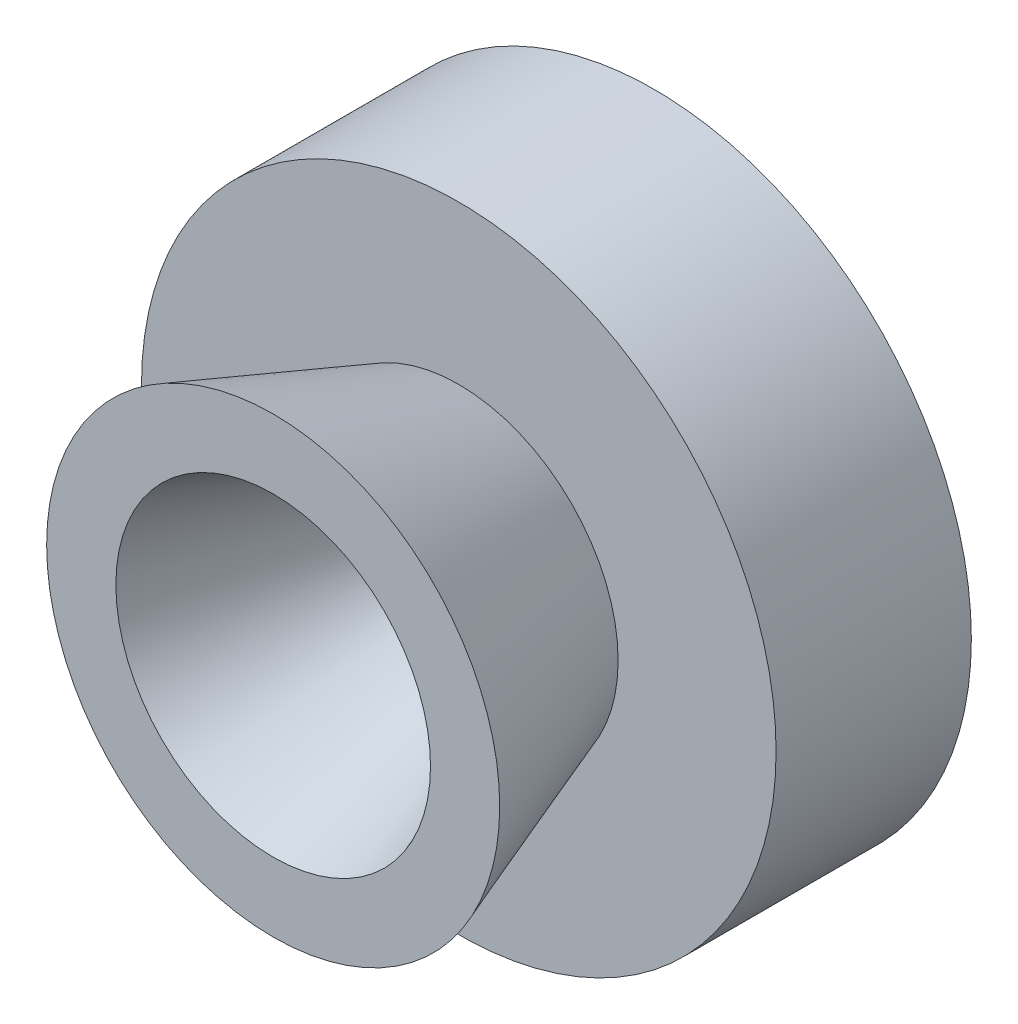
ISO-10303-21;
HEADER;
FILE_DESCRIPTION(('STEP AP214'),'2;1');
FILE_NAME('part.step','',(''),(''),'','','');
FILE_SCHEMA(('AUTOMOTIVE_DESIGN { 1 0 10303 214 1 1 1 1 }'));
ENDSEC;
DATA;
#1=APPLICATION_CONTEXT('core data for automotive mechanical design processes');
#2=APPLICATION_PROTOCOL_DEFINITION('international standard','automotive_design',2000,#1);
#3=PRODUCT_CONTEXT('',#1,'mechanical');
#4=PRODUCT('Part','Part','',(#3));
#5=PRODUCT_RELATED_PRODUCT_CATEGORY('part','',(#4));
#6=PRODUCT_DEFINITION_FORMATION('','',#4);
#7=PRODUCT_DEFINITION_CONTEXT('part definition',#1,'design');
#8=PRODUCT_DEFINITION('design','',#6,#7);
#9=PRODUCT_DEFINITION_SHAPE('','',#8);
#10=(LENGTH_UNIT() NAMED_UNIT(*) SI_UNIT(.MILLI.,.METRE.));
#11=(NAMED_UNIT(*) PLANE_ANGLE_UNIT() SI_UNIT($,.RADIAN.));
#12=(NAMED_UNIT(*) SI_UNIT($,.STERADIAN.) SOLID_ANGLE_UNIT());
#13=UNCERTAINTY_MEASURE_WITH_UNIT(LENGTH_MEASURE(1.E-05),#10,'distance_accuracy_value','');
#14=(GEOMETRIC_REPRESENTATION_CONTEXT(3) GLOBAL_UNCERTAINTY_ASSIGNED_CONTEXT((#13)) GLOBAL_UNIT_ASSIGNED_CONTEXT((#10,
#11,#12)) REPRESENTATION_CONTEXT('',''));
#15=CARTESIAN_POINT('',(0.,0.,0.));
#16=DIRECTION('',(0.,0.,1.));
#17=DIRECTION('',(1.,0.,0.));
#18=AXIS2_PLACEMENT_3D('',#15,#16,#17);
#19=CARTESIAN_POINT('',(0.,0.,0.680821993442596));
#20=DIRECTION('',(0.,0.,1.));
#21=DIRECTION('',(1.,0.,0.));
#22=AXIS2_PLACEMENT_3D('',#19,#20,#21);
#23=CONICAL_SURFACE('',#22,3.01561607773695,0.347353964830466);
#24=CARTESIAN_POINT('',(0.,0.,5.70274282077316));
#25=DIRECTION('',(0.,0.,-1.));
#26=DIRECTION('',(-1.,0.,0.));
#27=AXIS2_PLACEMENT_3D('',#24,#25,#26);
#28=CIRCLE('',#27,4.83371600111098);
#29=CARTESIAN_POINT('',(-4.83371600111098,0.,5.70274282077316));
#30=VERTEX_POINT('',#29);
#31=EDGE_CURVE('E84',#30,#30,#28,.F.);
#32=ORIENTED_EDGE('',*,*,#31,.T.);
#33=EDGE_LOOP('',(#32));
#34=FACE_BOUND('',#33,.T.);
#35=CARTESIAN_POINT('',(0.,0.,-1.));
#36=DIRECTION('',(0.,0.,-1.));
#37=DIRECTION('',(-1.,0.,0.));
#38=AXIS2_PLACEMENT_3D('',#35,#36,#37);
#39=CIRCLE('',#38,2.40710343037453);
#40=CARTESIAN_POINT('',(-2.40710343037453,0.,-1.));
#41=VERTEX_POINT('',#40);
#42=EDGE_CURVE('E62',#41,#41,#39,.T.);
#43=ORIENTED_EDGE('',*,*,#42,.T.);
#44=EDGE_LOOP('',(#43));
#45=FACE_BOUND('',#44,.T.);
#46=ADVANCED_FACE('F39',(#34,#45),#23,.F.);
#47=CARTESIAN_POINT('',(0.,0.,-6.));
#48=DIRECTION('',(0.,0.,1.));
#49=DIRECTION('',(1.,0.,0.));
#50=AXIS2_PLACEMENT_3D('',#47,#48,#49);
#51=CYLINDRICAL_SURFACE('',#50,9.75);
#52=CARTESIAN_POINT('',(0.,0.,-6.));
#53=DIRECTION('',(0.,0.,1.));
#54=DIRECTION('',(1.,0.,0.));
#55=AXIS2_PLACEMENT_3D('',#52,#53,#54);
#56=CIRCLE('',#55,9.75);
#57=CARTESIAN_POINT('',(9.75,0.,-6.));
#58=VERTEX_POINT('',#57);
#59=EDGE_CURVE('E48',#58,#58,#56,.T.);
#60=ORIENTED_EDGE('',*,*,#59,.T.);
#61=EDGE_LOOP('',(#60));
#62=FACE_BOUND('',#61,.T.);
#63=CARTESIAN_POINT('',(0.,0.,0.));
#64=DIRECTION('',(0.,0.,1.));
#65=DIRECTION('',(1.,0.,0.));
#66=AXIS2_PLACEMENT_3D('',#63,#64,#65);
#67=CIRCLE('',#66,9.75);
#68=CARTESIAN_POINT('',(9.75,0.,0.));
#69=VERTEX_POINT('',#68);
#70=EDGE_CURVE('E54',#69,#69,#67,.T.);
#71=ORIENTED_EDGE('',*,*,#70,.F.);
#72=EDGE_LOOP('',(#71));
#73=FACE_BOUND('',#72,.T.);
#74=ADVANCED_FACE('F41',(#62,#73),#51,.T.);
#75=CARTESIAN_POINT('',(0.,0.,-6.));
#76=DIRECTION('',(0.,0.,1.));
#77=DIRECTION('',(1.,0.,0.));
#78=AXIS2_PLACEMENT_3D('',#75,#76,#77);
#79=PLANE('',#78);
#80=CARTESIAN_POINT('',(0.,0.,-6.));
#81=DIRECTION('',(0.,0.,-1.));
#82=DIRECTION('',(-1.,0.,0.));
#83=AXIS2_PLACEMENT_3D('',#80,#81,#82);
#84=CIRCLE('',#83,5.75);
#85=CARTESIAN_POINT('',(-5.75,0.,-6.));
#86=VERTEX_POINT('',#85);
#87=EDGE_CURVE('E73',#86,#86,#84,.T.);
#88=ORIENTED_EDGE('',*,*,#87,.F.);
#89=EDGE_LOOP('',(#88));
#90=FACE_BOUND('',#89,.T.);
#91=ORIENTED_EDGE('',*,*,#59,.F.);
#92=EDGE_LOOP('',(#91));
#93=FACE_BOUND('',#92,.T.);
#94=ADVANCED_FACE('F113',(#90,#93),#79,.F.);
#95=CARTESIAN_POINT('',(0.,0.,0.));
#96=DIRECTION('',(0.,0.,1.));
#97=DIRECTION('',(1.,0.,0.));
#98=AXIS2_PLACEMENT_3D('',#95,#96,#97);
#99=PLANE('',#98);
#100=CARTESIAN_POINT('',(0.,0.,0.));
#101=DIRECTION('',(0.,0.,1.));
#102=DIRECTION('',(1.,0.,0.));
#103=AXIS2_PLACEMENT_3D('',#100,#101,#102);
#104=CIRCLE('',#103,4.89616956361414);
#105=CARTESIAN_POINT('',(4.89616956361414,0.,0.));
#106=VERTEX_POINT('',#105);
#107=EDGE_CURVE('E10',#106,#106,#104,.T.);
#108=ORIENTED_EDGE('',*,*,#107,.F.);
#109=EDGE_LOOP('',(#108));
#110=FACE_BOUND('',#109,.T.);
#111=ORIENTED_EDGE('',*,*,#70,.T.);
#112=EDGE_LOOP('',(#111));
#113=FACE_BOUND('',#112,.T.);
#114=ADVANCED_FACE('F108',(#110,#113),#99,.T.);
#115=CARTESIAN_POINT('',(0.,0.,0.));
#116=DIRECTION('',(0.,0.,1.));
#117=DIRECTION('',(1.,0.,0.));
#118=AXIS2_PLACEMENT_3D('',#115,#116,#117);
#119=CONICAL_SURFACE('',#118,4.89616956361414,0.347353964830466);
#120=CARTESIAN_POINT('',(0.,0.,5.70274282077316));
#121=DIRECTION('',(0.,0.,1.));
#122=DIRECTION('',(1.,0.,0.));
#123=AXIS2_PLACEMENT_3D('',#120,#121,#122);
#124=CIRCLE('',#123,6.96074936125717);
#125=CARTESIAN_POINT('',(6.96074936125717,0.,5.70274282077316));
#126=VERTEX_POINT('',#125);
#127=EDGE_CURVE('E57',#126,#126,#124,.T.);
#128=ORIENTED_EDGE('',*,*,#127,.F.);
#129=EDGE_LOOP('',(#128));
#130=FACE_BOUND('',#129,.T.);
#131=ORIENTED_EDGE('',*,*,#107,.T.);
#132=EDGE_LOOP('',(#131));
#133=FACE_BOUND('',#132,.T.);
#134=ADVANCED_FACE('F101',(#130,#133),#119,.T.);
#135=CARTESIAN_POINT('',(-6.96074936125717,0.,5.70274282077316));
#136=DIRECTION('',(0.,0.,-1.));
#137=DIRECTION('',(-1.,0.,0.));
#138=AXIS2_PLACEMENT_3D('',#135,#136,#137);
#139=PLANE('',#138);
#140=ORIENTED_EDGE('',*,*,#31,.F.);
#141=EDGE_LOOP('',(#140));
#142=FACE_BOUND('',#141,.T.);
#143=ORIENTED_EDGE('',*,*,#127,.T.);
#144=EDGE_LOOP('',(#143));
#145=FACE_BOUND('',#144,.T.);
#146=ADVANCED_FACE('F97',(#142,#145),#139,.F.);
#147=CARTESIAN_POINT('',(0.,0.,-1.));
#148=DIRECTION('',(0.,0.,-1.));
#149=DIRECTION('',(-1.,0.,0.));
#150=AXIS2_PLACEMENT_3D('',#147,#148,#149);
#151=PLANE('',#150);
#152=ORIENTED_EDGE('',*,*,#42,.F.);
#153=EDGE_LOOP('',(#152));
#154=FACE_BOUND('',#153,.T.);
#155=CARTESIAN_POINT('',(0.,0.,-1.));
#156=DIRECTION('',(0.,0.,-1.));
#157=DIRECTION('',(-1.,0.,0.));
#158=AXIS2_PLACEMENT_3D('',#155,#156,#157);
#159=CIRCLE('',#158,5.75);
#160=CARTESIAN_POINT('',(-5.75,0.,-1.));
#161=VERTEX_POINT('',#160);
#162=EDGE_CURVE('E65',#161,#161,#159,.T.);
#163=ORIENTED_EDGE('',*,*,#162,.T.);
#164=EDGE_LOOP('',(#163));
#165=FACE_BOUND('',#164,.T.);
#166=ADVANCED_FACE('F100',(#154,#165),#151,.T.);
#167=CARTESIAN_POINT('',(0.,0.,-1.));
#168=DIRECTION('',(0.,0.,-1.));
#169=DIRECTION('',(-1.,0.,0.));
#170=AXIS2_PLACEMENT_3D('',#167,#168,#169);
#171=CYLINDRICAL_SURFACE('',#170,5.75);
#172=ORIENTED_EDGE('',*,*,#162,.F.);
#173=EDGE_LOOP('',(#172));
#174=FACE_BOUND('',#173,.T.);
#175=CARTESIAN_POINT('',(0.,0.,-2.));
#176=DIRECTION('',(0.,0.,1.));
#177=DIRECTION('',(1.,0.,0.));
#178=AXIS2_PLACEMENT_3D('',#175,#176,#177);
#179=CIRCLE('',#178,5.75);
#180=CARTESIAN_POINT('',(5.75,0.,-2.));
#181=VERTEX_POINT('',#180);
#182=EDGE_CURVE('E43',#181,#181,#179,.T.);
#183=ORIENTED_EDGE('',*,*,#182,.F.);
#184=EDGE_LOOP('',(#183));
#185=FACE_BOUND('',#184,.T.);
#186=ADVANCED_FACE('F132',(#174,#185),#171,.F.);
#187=CARTESIAN_POINT('',(0.,0.,-4.));
#188=DIRECTION('',(0.,0.,1.));
#189=DIRECTION('',(1.,0.,0.));
#190=AXIS2_PLACEMENT_3D('',#187,#188,#189);
#191=PLANE('',#190);
#192=CARTESIAN_POINT('',(0.,0.,-4.));
#193=DIRECTION('',(0.,0.,1.));
#194=DIRECTION('',(1.,0.,0.));
#195=AXIS2_PLACEMENT_3D('',#192,#193,#194);
#196=CIRCLE('',#195,5.75);
#197=CARTESIAN_POINT('',(5.75,0.,-4.));
#198=VERTEX_POINT('',#197);
#199=EDGE_CURVE('E71',#198,#198,#196,.T.);
#200=ORIENTED_EDGE('',*,*,#199,.F.);
#201=EDGE_LOOP('',(#200));
#202=FACE_BOUND('',#201,.T.);
#203=CARTESIAN_POINT('',(0.,0.,-4.));
#204=DIRECTION('',(0.,0.,1.));
#205=DIRECTION('',(1.,0.,0.));
#206=AXIS2_PLACEMENT_3D('',#203,#204,#205);
#207=CIRCLE('',#206,7.75);
#208=CARTESIAN_POINT('',(7.75,0.,-4.));
#209=VERTEX_POINT('',#208);
#210=EDGE_CURVE('E85',#209,#209,#207,.T.);
#211=ORIENTED_EDGE('',*,*,#210,.T.);
#212=EDGE_LOOP('',(#211));
#213=FACE_BOUND('',#212,.T.);
#214=ADVANCED_FACE('F129',(#202,#213),#191,.T.);
#215=CARTESIAN_POINT('',(0.,0.,-6.));
#216=DIRECTION('',(0.,0.,1.));
#217=DIRECTION('',(1.,0.,0.));
#218=AXIS2_PLACEMENT_3D('',#215,#216,#217);
#219=CYLINDRICAL_SURFACE('',#218,7.75);
#220=ORIENTED_EDGE('',*,*,#210,.F.);
#221=EDGE_LOOP('',(#220));
#222=FACE_BOUND('',#221,.T.);
#223=CARTESIAN_POINT('',(0.,0.,-2.));
#224=DIRECTION('',(0.,0.,1.));
#225=DIRECTION('',(1.,0.,0.));
#226=AXIS2_PLACEMENT_3D('',#223,#224,#225);
#227=CIRCLE('',#226,7.75);
#228=CARTESIAN_POINT('',(7.75,0.,-2.));
#229=VERTEX_POINT('',#228);
#230=EDGE_CURVE('E89',#229,#229,#227,.T.);
#231=ORIENTED_EDGE('',*,*,#230,.T.);
#232=EDGE_LOOP('',(#231));
#233=FACE_BOUND('',#232,.T.);
#234=ADVANCED_FACE('F127',(#222,#233),#219,.F.);
#235=CARTESIAN_POINT('',(0.,0.,-2.));
#236=DIRECTION('',(0.,0.,1.));
#237=DIRECTION('',(1.,0.,0.));
#238=AXIS2_PLACEMENT_3D('',#235,#236,#237);
#239=PLANE('',#238);
#240=ORIENTED_EDGE('',*,*,#182,.T.);
#241=EDGE_LOOP('',(#240));
#242=FACE_BOUND('',#241,.T.);
#243=ORIENTED_EDGE('',*,*,#230,.F.);
#244=EDGE_LOOP('',(#243));
#245=FACE_BOUND('',#244,.T.);
#246=ADVANCED_FACE('F123',(#242,#245),#239,.F.);
#247=ORIENTED_EDGE('',*,*,#199,.T.);
#248=EDGE_LOOP('',(#247));
#249=FACE_BOUND('',#248,.T.);
#250=ORIENTED_EDGE('',*,*,#87,.T.);
#251=EDGE_LOOP('',(#250));
#252=FACE_BOUND('',#251,.T.);
#253=ADVANCED_FACE('F126',(#249,#252),#171,.F.);
#254=CLOSED_SHELL('',(#46,#74,#94,#114,#134,#146,#166,#186,#214,#234,#246,#253));
#255=MANIFOLD_SOLID_BREP('B2',#254);
#256=ADVANCED_BREP_SHAPE_REPRESENTATION('',(#18,#255),#14);
#257=SHAPE_DEFINITION_REPRESENTATION(#9,#256);
ENDSEC;
END-ISO-10303-21;
